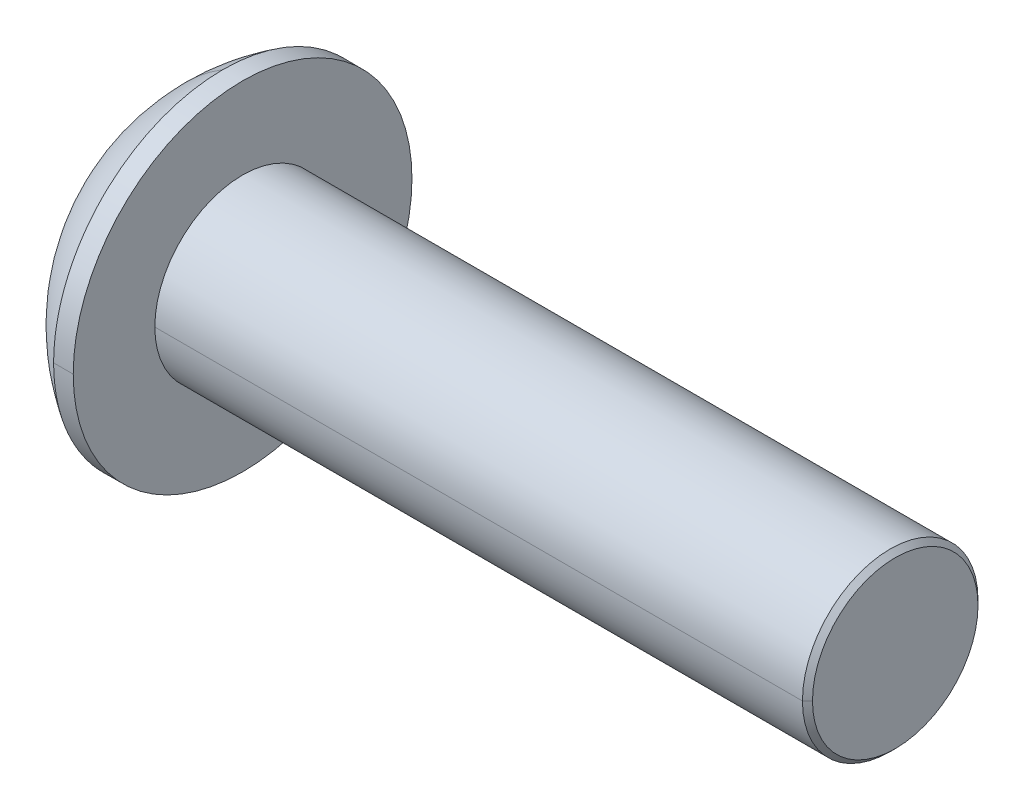
ISO-10303-21;
HEADER;
FILE_DESCRIPTION(('STEP AP214'),'2;1');
FILE_NAME('part.step','',(''),(''),'','','');
FILE_SCHEMA(('AUTOMOTIVE_DESIGN { 1 0 10303 214 1 1 1 1 }'));
ENDSEC;
DATA;
#1=APPLICATION_CONTEXT('core data for automotive mechanical design processes');
#2=APPLICATION_PROTOCOL_DEFINITION('international standard','automotive_design',2000,#1);
#3=PRODUCT_CONTEXT('',#1,'mechanical');
#4=PRODUCT('Part','Part','',(#3));
#5=PRODUCT_RELATED_PRODUCT_CATEGORY('part','',(#4));
#6=PRODUCT_DEFINITION_FORMATION('','',#4);
#7=PRODUCT_DEFINITION_CONTEXT('part definition',#1,'design');
#8=PRODUCT_DEFINITION('design','',#6,#7);
#9=PRODUCT_DEFINITION_SHAPE('','',#8);
#10=(LENGTH_UNIT() NAMED_UNIT(*) SI_UNIT(.MILLI.,.METRE.));
#11=(NAMED_UNIT(*) PLANE_ANGLE_UNIT() SI_UNIT($,.RADIAN.));
#12=(NAMED_UNIT(*) SI_UNIT($,.STERADIAN.) SOLID_ANGLE_UNIT());
#13=UNCERTAINTY_MEASURE_WITH_UNIT(LENGTH_MEASURE(1.E-05),#10,'distance_accuracy_value','');
#14=(GEOMETRIC_REPRESENTATION_CONTEXT(3) GLOBAL_UNCERTAINTY_ASSIGNED_CONTEXT((#13)) GLOBAL_UNIT_ASSIGNED_CONTEXT((#10,
#11,#12)) REPRESENTATION_CONTEXT('',''));
#15=CARTESIAN_POINT('',(0.,0.,0.));
#16=DIRECTION('',(0.,0.,1.));
#17=DIRECTION('',(1.,0.,0.));
#18=AXIS2_PLACEMENT_3D('',#15,#16,#17);
#19=CARTESIAN_POINT('',(14.5542,0.,0.));
#20=DIRECTION('',(-1.,0.,0.));
#21=DIRECTION('',(0.,0.,1.));
#22=AXIS2_PLACEMENT_3D('',#19,#20,#21);
#23=PLANE('',#22);
#24=CARTESIAN_POINT('',(14.5542,0.,0.));
#25=DIRECTION('',(-1.,0.,0.));
#26=DIRECTION('',(0.,0.,1.));
#27=AXIS2_PLACEMENT_3D('',#24,#25,#26);
#28=CIRCLE('',#27,1.61036);
#29=CARTESIAN_POINT('',(14.5542,0.,1.61036));
#30=VERTEX_POINT('',#29);
#31=CARTESIAN_POINT('',(14.5542,0.,-1.61036));
#32=VERTEX_POINT('',#31);
#33=EDGE_CURVE('E9',#30,#32,#28,.T.);
#34=ORIENTED_EDGE('',*,*,#33,.F.);
#35=CARTESIAN_POINT('',(14.5542,0.,0.));
#36=DIRECTION('',(-1.,0.,0.));
#37=DIRECTION('',(0.,0.,1.));
#38=AXIS2_PLACEMENT_3D('',#35,#36,#37);
#39=CIRCLE('',#38,1.61036);
#40=EDGE_CURVE('E364',#32,#30,#39,.T.);
#41=ORIENTED_EDGE('',*,*,#40,.F.);
#42=EDGE_LOOP('',(#34,#41));
#43=FACE_BOUND('',#42,.T.);
#44=ADVANCED_FACE('F15',(#43),#23,.F.);
#45=CARTESIAN_POINT('',(14.5542,0.,0.));
#46=DIRECTION('',(-1.,0.,0.));
#47=DIRECTION('',(0.,0.,1.));
#48=AXIS2_PLACEMENT_3D('',#45,#46,#47);
#49=CONICAL_SURFACE('',#48,1.61036,0.785398163397432);
#50=ORIENTED_EDGE('',*,*,#33,.T.);
#51=DIRECTION('',(-0.707106781186559,0.,-0.707106781186537));
#52=VECTOR('',#51,1.);
#53=CARTESIAN_POINT('',(14.5542,0.,-1.61036));
#54=LINE('',#53,#52);
#55=CARTESIAN_POINT('',(14.45641,0.,-1.70815));
#56=VERTEX_POINT('',#55);
#57=EDGE_CURVE('E362',#32,#56,#54,.T.);
#58=ORIENTED_EDGE('',*,*,#57,.T.);
#59=CARTESIAN_POINT('',(14.45641,0.,0.));
#60=DIRECTION('',(-1.,0.,0.));
#61=DIRECTION('',(0.,0.,1.));
#62=AXIS2_PLACEMENT_3D('',#59,#60,#61);
#63=CIRCLE('',#62,1.70815);
#64=CARTESIAN_POINT('',(14.45641,0.,1.70815));
#65=VERTEX_POINT('',#64);
#66=EDGE_CURVE('E359',#65,#56,#63,.T.);
#67=ORIENTED_EDGE('',*,*,#66,.F.);
#68=DIRECTION('',(-0.707106781186559,0.,0.707106781186537));
#69=VECTOR('',#68,1.);
#70=CARTESIAN_POINT('',(14.5542,0.,1.61036));
#71=LINE('',#70,#69);
#72=EDGE_CURVE('E23',#30,#65,#71,.T.);
#73=ORIENTED_EDGE('',*,*,#72,.F.);
#74=EDGE_LOOP('',(#50,#58,#67,#73));
#75=FACE_BOUND('',#74,.T.);
#76=ADVANCED_FACE('F378',(#75),#49,.T.);
#77=CARTESIAN_POINT('',(14.5542,0.,0.));
#78=DIRECTION('',(-1.,0.,0.));
#79=DIRECTION('',(0.,0.,1.));
#80=AXIS2_PLACEMENT_3D('',#77,#78,#79);
#81=CONICAL_SURFACE('',#80,1.61036,0.785398163397432);
#82=ORIENTED_EDGE('',*,*,#57,.F.);
#83=ORIENTED_EDGE('',*,*,#40,.T.);
#84=ORIENTED_EDGE('',*,*,#72,.T.);
#85=CARTESIAN_POINT('',(14.45641,0.,0.));
#86=DIRECTION('',(-1.,0.,0.));
#87=DIRECTION('',(0.,0.,1.));
#88=AXIS2_PLACEMENT_3D('',#85,#86,#87);
#89=CIRCLE('',#88,1.70815);
#90=EDGE_CURVE('E351',#56,#65,#89,.T.);
#91=ORIENTED_EDGE('',*,*,#90,.F.);
#92=EDGE_LOOP('',(#82,#83,#84,#91));
#93=FACE_BOUND('',#92,.T.);
#94=ADVANCED_FACE('F374',(#93),#81,.T.);
#95=CARTESIAN_POINT('',(0.,0.,0.));
#96=DIRECTION('',(-1.,0.,0.));
#97=DIRECTION('',(0.,0.,1.));
#98=AXIS2_PLACEMENT_3D('',#95,#96,#97);
#99=CYLINDRICAL_SURFACE('',#98,1.70815);
#100=ORIENTED_EDGE('',*,*,#66,.T.);
#101=DIRECTION('',(-1.,0.,0.));
#102=VECTOR('',#101,1.);
#103=CARTESIAN_POINT('',(0.,0.,-1.70815));
#104=LINE('',#103,#102);
#105=CARTESIAN_POINT('',(1.8542,0.,-1.70815));
#106=VERTEX_POINT('',#105);
#107=EDGE_CURVE('E348',#56,#106,#104,.T.);
#108=ORIENTED_EDGE('',*,*,#107,.T.);
#109=CARTESIAN_POINT('',(1.8542,0.,0.));
#110=DIRECTION('',(-1.,0.,0.));
#111=DIRECTION('',(0.,0.,1.));
#112=AXIS2_PLACEMENT_3D('',#109,#110,#111);
#113=CIRCLE('',#112,1.70815);
#114=CARTESIAN_POINT('',(1.8542,0.,1.70815));
#115=VERTEX_POINT('',#114);
#116=EDGE_CURVE('E340',#115,#106,#113,.T.);
#117=ORIENTED_EDGE('',*,*,#116,.F.);
#118=DIRECTION('',(-1.,0.,0.));
#119=VECTOR('',#118,1.);
#120=CARTESIAN_POINT('',(0.,0.,1.70815));
#121=LINE('',#120,#119);
#122=EDGE_CURVE('E354',#65,#115,#121,.T.);
#123=ORIENTED_EDGE('',*,*,#122,.F.);
#124=EDGE_LOOP('',(#100,#108,#117,#123));
#125=FACE_BOUND('',#124,.T.);
#126=ADVANCED_FACE('F381',(#125),#99,.T.);
#127=CARTESIAN_POINT('',(0.,0.,0.));
#128=DIRECTION('',(-1.,0.,0.));
#129=DIRECTION('',(0.,0.,1.));
#130=AXIS2_PLACEMENT_3D('',#127,#128,#129);
#131=CYLINDRICAL_SURFACE('',#130,1.70815);
#132=ORIENTED_EDGE('',*,*,#107,.F.);
#133=ORIENTED_EDGE('',*,*,#90,.T.);
#134=ORIENTED_EDGE('',*,*,#122,.T.);
#135=CARTESIAN_POINT('',(1.8542,0.,0.));
#136=DIRECTION('',(-1.,0.,0.));
#137=DIRECTION('',(0.,0.,1.));
#138=AXIS2_PLACEMENT_3D('',#135,#136,#137);
#139=CIRCLE('',#138,1.70815);
#140=EDGE_CURVE('E342',#106,#115,#139,.T.);
#141=ORIENTED_EDGE('',*,*,#140,.F.);
#142=EDGE_LOOP('',(#132,#133,#134,#141));
#143=FACE_BOUND('',#142,.T.);
#144=ADVANCED_FACE('F383',(#143),#131,.T.);
#145=CARTESIAN_POINT('',(1.8542,1.70815,0.));
#146=DIRECTION('',(-1.,0.,0.));
#147=DIRECTION('',(0.,0.,1.));
#148=AXIS2_PLACEMENT_3D('',#145,#146,#147);
#149=PLANE('',#148);
#150=ORIENTED_EDGE('',*,*,#116,.T.);
#151=ORIENTED_EDGE('',*,*,#140,.T.);
#152=EDGE_LOOP('',(#150,#151));
#153=FACE_BOUND('',#152,.T.);
#154=CARTESIAN_POINT('',(1.8542,0.,0.));
#155=DIRECTION('',(-1.,0.,0.));
#156=DIRECTION('',(0.,0.,1.));
#157=AXIS2_PLACEMENT_3D('',#154,#155,#156);
#158=CIRCLE('',#157,3.29565);
#159=CARTESIAN_POINT('',(1.8542,0.,3.29565));
#160=VERTEX_POINT('',#159);
#161=CARTESIAN_POINT('',(1.8542,0.,-3.29565));
#162=VERTEX_POINT('',#161);
#163=EDGE_CURVE('E300',#160,#162,#158,.T.);
#164=ORIENTED_EDGE('',*,*,#163,.F.);
#165=CARTESIAN_POINT('',(1.8542,0.,0.));
#166=DIRECTION('',(-1.,0.,0.));
#167=DIRECTION('',(0.,0.,1.));
#168=AXIS2_PLACEMENT_3D('',#165,#166,#167);
#169=CIRCLE('',#168,3.29565);
#170=EDGE_CURVE('E337',#162,#160,#169,.T.);
#171=ORIENTED_EDGE('',*,*,#170,.F.);
#172=EDGE_LOOP('',(#164,#171));
#173=FACE_BOUND('',#172,.T.);
#174=ADVANCED_FACE('F387',(#153,#173),#149,.F.);
#175=CARTESIAN_POINT('',(-997.989959248641,0.,0.));
#176=DIRECTION('',(-1.,0.,0.));
#177=DIRECTION('',(0.,0.,1.));
#178=AXIS2_PLACEMENT_3D('',#175,#176,#177);
#179=CONICAL_SURFACE('',#178,1732.05080756886,1.0471975511966);
#180=DIRECTION('',(-0.5,0.,0.866025403784436));
#181=VECTOR('',#180,1.);
#182=CARTESIAN_POINT('',(2.01004075135859,0.,0.));
#183=LINE('',#182,#181);
#184=CARTESIAN_POINT('',(2.01004075135859,0.,0.));
#185=VERTEX_POINT('',#184);
#186=CARTESIAN_POINT('',(1.3208,0.,1.1938));
#187=VERTEX_POINT('',#186);
#188=EDGE_CURVE('E293',#185,#187,#183,.T.);
#189=ORIENTED_EDGE('',*,*,#188,.F.);
#190=DIRECTION('',(-0.5,0.,-0.866025403784436));
#191=VECTOR('',#190,1.);
#192=CARTESIAN_POINT('',(2.01004075135859,0.,0.));
#193=LINE('',#192,#191);
#194=CARTESIAN_POINT('',(1.3208,0.,-1.1938));
#195=VERTEX_POINT('',#194);
#196=EDGE_CURVE('E323',#185,#195,#193,.T.);
#197=ORIENTED_EDGE('',*,*,#196,.T.);
#198=CARTESIAN_POINT('',(1.3208,0.,0.));
#199=DIRECTION('',(-1.,0.,0.));
#200=DIRECTION('',(0.,0.,1.));
#201=AXIS2_PLACEMENT_3D('',#198,#199,#200);
#202=CIRCLE('',#201,1.1938);
#203=CARTESIAN_POINT('',(1.3208,-1.03386112703786,-0.5969));
#204=VERTEX_POINT('',#203);
#205=EDGE_CURVE('E255',#195,#204,#202,.T.);
#206=ORIENTED_EDGE('',*,*,#205,.T.);
#207=CARTESIAN_POINT('',(1.3208,0.,0.));
#208=DIRECTION('',(-1.,0.,0.));
#209=DIRECTION('',(0.,0.,1.));
#210=AXIS2_PLACEMENT_3D('',#207,#208,#209);
#211=CIRCLE('',#210,1.1938);
#212=CARTESIAN_POINT('',(1.3208,-1.03386112703786,0.5969));
#213=VERTEX_POINT('',#212);
#214=EDGE_CURVE('E246',#204,#213,#211,.T.);
#215=ORIENTED_EDGE('',*,*,#214,.T.);
#216=CARTESIAN_POINT('',(1.3208,0.,0.));
#217=DIRECTION('',(-1.,0.,0.));
#218=DIRECTION('',(0.,0.,1.));
#219=AXIS2_PLACEMENT_3D('',#216,#217,#218);
#220=CIRCLE('',#219,1.1938);
#221=EDGE_CURVE('E251',#213,#187,#220,.T.);
#222=ORIENTED_EDGE('',*,*,#221,.T.);
#223=EDGE_LOOP('',(#189,#197,#206,#215,#222));
#224=FACE_BOUND('',#223,.T.);
#225=ADVANCED_FACE('F386',(#224),#179,.F.);
#226=CARTESIAN_POINT('',(0.,0.,0.));
#227=DIRECTION('',(-1.,0.,0.));
#228=DIRECTION('',(0.,0.,1.));
#229=AXIS2_PLACEMENT_3D('',#226,#227,#228);
#230=CYLINDRICAL_SURFACE('',#229,3.29565);
#231=DIRECTION('',(-1.,0.,0.));
#232=VECTOR('',#231,1.);
#233=CARTESIAN_POINT('',(0.,0.,-3.29565));
#234=LINE('',#233,#232);
#235=CARTESIAN_POINT('',(1.4732,0.,-3.29565));
#236=VERTEX_POINT('',#235);
#237=EDGE_CURVE('E302',#162,#236,#234,.T.);
#238=ORIENTED_EDGE('',*,*,#237,.F.);
#239=ORIENTED_EDGE('',*,*,#170,.T.);
#240=DIRECTION('',(-1.,0.,0.));
#241=VECTOR('',#240,1.);
#242=CARTESIAN_POINT('',(0.,0.,3.29565));
#243=LINE('',#242,#241);
#244=CARTESIAN_POINT('',(1.4732,0.,3.29565));
#245=VERTEX_POINT('',#244);
#246=EDGE_CURVE('E331',#160,#245,#243,.T.);
#247=ORIENTED_EDGE('',*,*,#246,.T.);
#248=CARTESIAN_POINT('',(1.4732,0.,0.));
#249=DIRECTION('',(-1.,0.,0.));
#250=DIRECTION('',(0.,0.,1.));
#251=AXIS2_PLACEMENT_3D('',#248,#249,#250);
#252=CIRCLE('',#251,3.29565);
#253=CARTESIAN_POINT('',(1.4732,-3.29565,0.));
#254=VERTEX_POINT('',#253);
#255=EDGE_CURVE('E296',#254,#245,#252,.T.);
#256=ORIENTED_EDGE('',*,*,#255,.F.);
#257=CARTESIAN_POINT('',(1.4732,0.,0.));
#258=DIRECTION('',(-1.,0.,0.));
#259=DIRECTION('',(0.,0.,1.));
#260=AXIS2_PLACEMENT_3D('',#257,#258,#259);
#261=CIRCLE('',#260,3.29565);
#262=EDGE_CURVE('E316',#236,#254,#261,.T.);
#263=ORIENTED_EDGE('',*,*,#262,.F.);
#264=EDGE_LOOP('',(#238,#239,#247,#256,#263));
#265=FACE_BOUND('',#264,.T.);
#266=ADVANCED_FACE('F399',(#265),#230,.T.);
#267=CARTESIAN_POINT('',(0.,0.,0.));
#268=DIRECTION('',(-1.,0.,0.));
#269=DIRECTION('',(0.,0.,1.));
#270=AXIS2_PLACEMENT_3D('',#267,#268,#269);
#271=CYLINDRICAL_SURFACE('',#270,3.29565);
#272=ORIENTED_EDGE('',*,*,#163,.T.);
#273=ORIENTED_EDGE('',*,*,#237,.T.);
#274=CARTESIAN_POINT('',(1.4732,0.,0.));
#275=DIRECTION('',(-1.,0.,0.));
#276=DIRECTION('',(0.,0.,1.));
#277=AXIS2_PLACEMENT_3D('',#274,#275,#276);
#278=CIRCLE('',#277,3.29565);
#279=CARTESIAN_POINT('',(1.4732,3.29565,0.));
#280=VERTEX_POINT('',#279);
#281=EDGE_CURVE('E315',#280,#236,#278,.T.);
#282=ORIENTED_EDGE('',*,*,#281,.F.);
#283=CARTESIAN_POINT('',(1.4732,0.,0.));
#284=DIRECTION('',(-1.,0.,0.));
#285=DIRECTION('',(0.,0.,1.));
#286=AXIS2_PLACEMENT_3D('',#283,#284,#285);
#287=CIRCLE('',#286,3.29565);
#288=EDGE_CURVE('E303',#245,#280,#287,.T.);
#289=ORIENTED_EDGE('',*,*,#288,.F.);
#290=ORIENTED_EDGE('',*,*,#246,.F.);
#291=EDGE_LOOP('',(#272,#273,#282,#289,#290));
#292=FACE_BOUND('',#291,.T.);
#293=ADVANCED_FACE('F395',(#292),#271,.T.);
#294=CARTESIAN_POINT('',(1.3208,-2.06772225407573,-1.1938));
#295=DIRECTION('',(1.,0.,0.));
#296=DIRECTION('',(0.,1.,0.));
#297=AXIS2_PLACEMENT_3D('',#294,#295,#296);
#298=PLANE('',#297);
#299=ORIENTED_EDGE('',*,*,#221,.F.);
#300=DIRECTION('',(0.,-0.5,-0.866025403784439));
#301=VECTOR('',#300,1.);
#302=CARTESIAN_POINT('',(1.3208,-1.37848150271715,0.));
#303=LINE('',#302,#301);
#304=CARTESIAN_POINT('',(1.3208,-0.689240751358574,1.1938));
#305=VERTEX_POINT('',#304);
#306=EDGE_CURVE('E317',#305,#213,#303,.T.);
#307=ORIENTED_EDGE('',*,*,#306,.F.);
#308=DIRECTION('',(0.,-1.,0.));
#309=VECTOR('',#308,1.);
#310=CARTESIAN_POINT('',(1.3208,-0.689240751358574,1.1938));
#311=LINE('',#310,#309);
#312=EDGE_CURVE('E284',#187,#305,#311,.T.);
#313=ORIENTED_EDGE('',*,*,#312,.F.);
#314=EDGE_LOOP('',(#299,#307,#313));
#315=FACE_BOUND('',#314,.T.);
#316=ADVANCED_FACE('F441',(#315),#298,.F.);
#317=CARTESIAN_POINT('',(1.3208,-2.06772225407573,-1.1938));
#318=DIRECTION('',(1.,0.,0.));
#319=DIRECTION('',(0.,1.,0.));
#320=AXIS2_PLACEMENT_3D('',#317,#318,#319);
#321=PLANE('',#320);
#322=ORIENTED_EDGE('',*,*,#214,.F.);
#323=DIRECTION('',(0.,0.5,-0.866025403784439));
#324=VECTOR('',#323,1.);
#325=CARTESIAN_POINT('',(1.3208,-0.689240751358574,-1.1938));
#326=LINE('',#325,#324);
#327=CARTESIAN_POINT('',(1.3208,-1.37848150271715,0.));
#328=VERTEX_POINT('',#327);
#329=EDGE_CURVE('E267',#328,#204,#326,.T.);
#330=ORIENTED_EDGE('',*,*,#329,.F.);
#331=DIRECTION('',(0.,-0.5,-0.866025403784439));
#332=VECTOR('',#331,1.);
#333=CARTESIAN_POINT('',(1.3208,-1.37848150271715,0.));
#334=LINE('',#333,#332);
#335=EDGE_CURVE('E319',#213,#328,#334,.T.);
#336=ORIENTED_EDGE('',*,*,#335,.F.);
#337=EDGE_LOOP('',(#322,#330,#336));
#338=FACE_BOUND('',#337,.T.);
#339=ADVANCED_FACE('F439',(#338),#321,.F.);
#340=CARTESIAN_POINT('',(1.3208,-2.06772225407573,-1.1938));
#341=DIRECTION('',(1.,0.,0.));
#342=DIRECTION('',(0.,1.,0.));
#343=AXIS2_PLACEMENT_3D('',#340,#341,#342);
#344=PLANE('',#343);
#345=CARTESIAN_POINT('',(1.3208,0.,0.));
#346=DIRECTION('',(-1.,0.,0.));
#347=DIRECTION('',(0.,0.,1.));
#348=AXIS2_PLACEMENT_3D('',#345,#346,#347);
#349=CIRCLE('',#348,1.1938);
#350=CARTESIAN_POINT('',(1.3208,1.03386112703786,0.5969));
#351=VERTEX_POINT('',#350);
#352=EDGE_CURVE('E266',#187,#351,#349,.T.);
#353=ORIENTED_EDGE('',*,*,#352,.F.);
#354=DIRECTION('',(0.,-1.,0.));
#355=VECTOR('',#354,1.);
#356=CARTESIAN_POINT('',(1.3208,-0.689240751358574,1.1938));
#357=LINE('',#356,#355);
#358=CARTESIAN_POINT('',(1.3208,0.689240751358576,1.1938));
#359=VERTEX_POINT('',#358);
#360=EDGE_CURVE('E276',#359,#187,#357,.T.);
#361=ORIENTED_EDGE('',*,*,#360,.F.);
#362=DIRECTION('',(0.,-0.5,0.866025403784439));
#363=VECTOR('',#362,1.);
#364=CARTESIAN_POINT('',(1.3208,0.689240751358576,1.1938));
#365=LINE('',#364,#363);
#366=EDGE_CURVE('E228',#351,#359,#365,.T.);
#367=ORIENTED_EDGE('',*,*,#366,.F.);
#368=EDGE_LOOP('',(#353,#361,#367));
#369=FACE_BOUND('',#368,.T.);
#370=ADVANCED_FACE('F444',(#369),#344,.F.);
#371=CARTESIAN_POINT('',(1.3208,-2.06772225407573,-1.1938));
#372=DIRECTION('',(1.,0.,0.));
#373=DIRECTION('',(0.,1.,0.));
#374=AXIS2_PLACEMENT_3D('',#371,#372,#373);
#375=PLANE('',#374);
#376=ORIENTED_EDGE('',*,*,#205,.F.);
#377=DIRECTION('',(0.,1.,0.));
#378=VECTOR('',#377,1.);
#379=CARTESIAN_POINT('',(1.3208,0.689240751358577,-1.1938));
#380=LINE('',#379,#378);
#381=CARTESIAN_POINT('',(1.3208,-0.689240751358574,-1.1938));
#382=VERTEX_POINT('',#381);
#383=EDGE_CURVE('E180',#382,#195,#380,.T.);
#384=ORIENTED_EDGE('',*,*,#383,.F.);
#385=DIRECTION('',(0.,0.5,-0.866025403784439));
#386=VECTOR('',#385,1.);
#387=CARTESIAN_POINT('',(1.3208,-0.689240751358574,-1.1938));
#388=LINE('',#387,#386);
#389=EDGE_CURVE('E272',#204,#382,#388,.T.);
#390=ORIENTED_EDGE('',*,*,#389,.F.);
#391=EDGE_LOOP('',(#376,#384,#390));
#392=FACE_BOUND('',#391,.T.);
#393=ADVANCED_FACE('F450',(#392),#375,.F.);
#394=CARTESIAN_POINT('',(-997.989959248641,0.,0.));
#395=DIRECTION('',(-1.,0.,0.));
#396=DIRECTION('',(0.,0.,1.));
#397=AXIS2_PLACEMENT_3D('',#394,#395,#396);
#398=CONICAL_SURFACE('',#397,1732.05080756886,1.0471975511966);
#399=ORIENTED_EDGE('',*,*,#196,.F.);
#400=ORIENTED_EDGE('',*,*,#188,.T.);
#401=ORIENTED_EDGE('',*,*,#352,.T.);
#402=CARTESIAN_POINT('',(1.3208,0.,0.));
#403=DIRECTION('',(-1.,0.,0.));
#404=DIRECTION('',(0.,0.,1.));
#405=AXIS2_PLACEMENT_3D('',#402,#403,#404);
#406=CIRCLE('',#405,1.1938);
#407=CARTESIAN_POINT('',(1.3208,1.03386112703786,-0.5969));
#408=VERTEX_POINT('',#407);
#409=EDGE_CURVE('E211',#351,#408,#406,.T.);
#410=ORIENTED_EDGE('',*,*,#409,.T.);
#411=CARTESIAN_POINT('',(1.3208,0.,0.));
#412=DIRECTION('',(-1.,0.,0.));
#413=DIRECTION('',(0.,0.,1.));
#414=AXIS2_PLACEMENT_3D('',#411,#412,#413);
#415=CIRCLE('',#414,1.1938);
#416=EDGE_CURVE('E183',#408,#195,#415,.T.);
#417=ORIENTED_EDGE('',*,*,#416,.T.);
#418=EDGE_LOOP('',(#399,#400,#401,#410,#417));
#419=FACE_BOUND('',#418,.T.);
#420=ADVANCED_FACE('F446',(#419),#398,.F.);
#421=CARTESIAN_POINT('',(1.3208,-1.37848150271715,0.));
#422=DIRECTION('',(0.,0.866025403784439,-0.5));
#423=DIRECTION('',(-1.,0.,0.));
#424=AXIS2_PLACEMENT_3D('',#421,#422,#423);
#425=PLANE('',#424);
#426=ORIENTED_EDGE('',*,*,#306,.T.);
#427=ORIENTED_EDGE('',*,*,#335,.T.);
#428=DIRECTION('',(-1.,0.,0.));
#429=VECTOR('',#428,1.);
#430=CARTESIAN_POINT('',(1.3208,-1.37848150271715,0.));
#431=LINE('',#430,#429);
#432=CARTESIAN_POINT('',(0.,-1.37848150271715,0.));
#433=VERTEX_POINT('',#432);
#434=EDGE_CURVE('E277',#328,#433,#431,.T.);
#435=ORIENTED_EDGE('',*,*,#434,.T.);
#436=DIRECTION('',(0.,-0.5,-0.866025403784439));
#437=VECTOR('',#436,1.);
#438=CARTESIAN_POINT('',(0.,-1.37848150271715,0.));
#439=LINE('',#438,#437);
#440=CARTESIAN_POINT('',(0.,-0.689240751358574,1.1938));
#441=VERTEX_POINT('',#440);
#442=EDGE_CURVE('E236',#441,#433,#439,.T.);
#443=ORIENTED_EDGE('',*,*,#442,.F.);
#444=DIRECTION('',(-1.,0.,0.));
#445=VECTOR('',#444,1.);
#446=CARTESIAN_POINT('',(1.3208,-0.689240751358574,1.1938));
#447=LINE('',#446,#445);
#448=EDGE_CURVE('E290',#305,#441,#447,.T.);
#449=ORIENTED_EDGE('',*,*,#448,.F.);
#450=EDGE_LOOP('',(#426,#427,#435,#443,#449));
#451=FACE_BOUND('',#450,.T.);
#452=ADVANCED_FACE('F448',(#451),#425,.T.);
#453=CARTESIAN_POINT('',(3.50132362607759,0.,0.));
#454=DIRECTION('',(0.,0.,-1.));
#455=DIRECTION('',(0.,1.,0.));
#456=AXIS2_PLACEMENT_3D('',#453,#454,#455);
#457=SPHERICAL_SURFACE('',#456,3.86970210289553);
#458=ORIENTED_EDGE('',*,*,#281,.T.);
#459=ORIENTED_EDGE('',*,*,#262,.T.);
#460=CARTESIAN_POINT('',(3.50132362607759,0.,0.));
#461=DIRECTION('',(0.,0.,-1.));
#462=DIRECTION('',(0.,1.,0.));
#463=AXIS2_PLACEMENT_3D('',#460,#461,#462);
#464=CIRCLE('',#463,3.86970210289553);
#465=CARTESIAN_POINT('',(0.,-1.647825,0.));
#466=VERTEX_POINT('',#465);
#467=EDGE_CURVE('E289',#254,#466,#464,.T.);
#468=ORIENTED_EDGE('',*,*,#467,.T.);
#469=CARTESIAN_POINT('',(0.,0.,0.));
#470=DIRECTION('',(-1.,0.,0.));
#471=DIRECTION('',(0.,0.,1.));
#472=AXIS2_PLACEMENT_3D('',#469,#470,#471);
#473=CIRCLE('',#472,1.647825);
#474=CARTESIAN_POINT('',(0.,1.647825,0.));
#475=VERTEX_POINT('',#474);
#476=EDGE_CURVE('E191',#475,#466,#473,.T.);
#477=ORIENTED_EDGE('',*,*,#476,.F.);
#478=CARTESIAN_POINT('',(3.50132362607759,0.,0.));
#479=DIRECTION('',(0.,0.,1.));
#480=DIRECTION('',(1.,0.,0.));
#481=AXIS2_PLACEMENT_3D('',#478,#479,#480);
#482=CIRCLE('',#481,3.86970210289553);
#483=EDGE_CURVE('E310',#280,#475,#482,.T.);
#484=ORIENTED_EDGE('',*,*,#483,.F.);
#485=EDGE_LOOP('',(#458,#459,#468,#477,#484));
#486=FACE_BOUND('',#485,.T.);
#487=ADVANCED_FACE('F402',(#486),#457,.T.);
#488=CARTESIAN_POINT('',(3.50132362607759,0.,0.));
#489=DIRECTION('',(0.,0.,-1.));
#490=DIRECTION('',(0.,1.,0.));
#491=AXIS2_PLACEMENT_3D('',#488,#489,#490);
#492=SPHERICAL_SURFACE('',#491,3.86970210289553);
#493=ORIENTED_EDGE('',*,*,#467,.F.);
#494=ORIENTED_EDGE('',*,*,#255,.T.);
#495=ORIENTED_EDGE('',*,*,#288,.T.);
#496=ORIENTED_EDGE('',*,*,#483,.T.);
#497=CARTESIAN_POINT('',(0.,0.,0.));
#498=DIRECTION('',(-1.,0.,0.));
#499=DIRECTION('',(0.,0.,1.));
#500=AXIS2_PLACEMENT_3D('',#497,#498,#499);
#501=CIRCLE('',#500,1.647825);
#502=EDGE_CURVE('E221',#466,#475,#501,.T.);
#503=ORIENTED_EDGE('',*,*,#502,.F.);
#504=EDGE_LOOP('',(#493,#494,#495,#496,#503));
#505=FACE_BOUND('',#504,.T.);
#506=ADVANCED_FACE('F407',(#505),#492,.T.);
#507=CARTESIAN_POINT('',(1.3208,-0.689240751358574,1.1938));
#508=DIRECTION('',(0.,0.,-1.));
#509=DIRECTION('',(-1.,0.,0.));
#510=AXIS2_PLACEMENT_3D('',#507,#508,#509);
#511=PLANE('',#510);
#512=ORIENTED_EDGE('',*,*,#360,.T.);
#513=ORIENTED_EDGE('',*,*,#312,.T.);
#514=ORIENTED_EDGE('',*,*,#448,.T.);
#515=DIRECTION('',(0.,-1.,0.));
#516=VECTOR('',#515,1.);
#517=CARTESIAN_POINT('',(0.,-0.689240751358574,1.1938));
#518=LINE('',#517,#516);
#519=CARTESIAN_POINT('',(0.,0.689240751358576,1.1938));
#520=VERTEX_POINT('',#519);
#521=EDGE_CURVE('E235',#520,#441,#518,.T.);
#522=ORIENTED_EDGE('',*,*,#521,.F.);
#523=DIRECTION('',(-1.,0.,0.));
#524=VECTOR('',#523,1.);
#525=CARTESIAN_POINT('',(1.3208,0.689240751358576,1.1938));
#526=LINE('',#525,#524);
#527=EDGE_CURVE('E265',#359,#520,#526,.T.);
#528=ORIENTED_EDGE('',*,*,#527,.F.);
#529=EDGE_LOOP('',(#512,#513,#514,#522,#528));
#530=FACE_BOUND('',#529,.T.);
#531=ADVANCED_FACE('F462',(#530),#511,.T.);
#532=CARTESIAN_POINT('',(1.3208,-0.689240751358574,-1.1938));
#533=DIRECTION('',(0.,0.866025403784439,0.5));
#534=DIRECTION('',(1.,0.,0.));
#535=AXIS2_PLACEMENT_3D('',#532,#533,#534);
#536=PLANE('',#535);
#537=ORIENTED_EDGE('',*,*,#329,.T.);
#538=ORIENTED_EDGE('',*,*,#389,.T.);
#539=DIRECTION('',(-1.,0.,0.));
#540=VECTOR('',#539,1.);
#541=CARTESIAN_POINT('',(1.3208,-0.689240751358574,-1.1938));
#542=LINE('',#541,#540);
#543=CARTESIAN_POINT('',(0.,-0.689240751358574,-1.1938));
#544=VERTEX_POINT('',#543);
#545=EDGE_CURVE('E207',#382,#544,#542,.T.);
#546=ORIENTED_EDGE('',*,*,#545,.T.);
#547=DIRECTION('',(0.,0.5,-0.866025403784439));
#548=VECTOR('',#547,1.);
#549=CARTESIAN_POINT('',(0.,-0.689240751358574,-1.1938));
#550=LINE('',#549,#548);
#551=EDGE_CURVE('E241',#433,#544,#550,.T.);
#552=ORIENTED_EDGE('',*,*,#551,.F.);
#553=ORIENTED_EDGE('',*,*,#434,.F.);
#554=EDGE_LOOP('',(#537,#538,#546,#552,#553));
#555=FACE_BOUND('',#554,.T.);
#556=ADVANCED_FACE('F467',(#555),#536,.T.);
#557=CARTESIAN_POINT('',(1.3208,0.689240751358576,1.1938));
#558=DIRECTION('',(0.,-0.866025403784439,-0.5));
#559=DIRECTION('',(0.,0.5,-0.866025403784439));
#560=AXIS2_PLACEMENT_3D('',#557,#558,#559);
#561=PLANE('',#560);
#562=DIRECTION('',(0.,-0.5,0.866025403784439));
#563=VECTOR('',#562,1.);
#564=CARTESIAN_POINT('',(1.3208,0.689240751358576,1.1938));
#565=LINE('',#564,#563);
#566=CARTESIAN_POINT('',(1.3208,1.37848150271715,0.));
#567=VERTEX_POINT('',#566);
#568=EDGE_CURVE('E223',#567,#351,#565,.T.);
#569=ORIENTED_EDGE('',*,*,#568,.T.);
#570=ORIENTED_EDGE('',*,*,#366,.T.);
#571=ORIENTED_EDGE('',*,*,#527,.T.);
#572=DIRECTION('',(0.,-0.5,0.866025403784439));
#573=VECTOR('',#572,1.);
#574=CARTESIAN_POINT('',(0.,0.689240751358576,1.1938));
#575=LINE('',#574,#573);
#576=CARTESIAN_POINT('',(0.,1.37848150271715,0.));
#577=VERTEX_POINT('',#576);
#578=EDGE_CURVE('E216',#577,#520,#575,.T.);
#579=ORIENTED_EDGE('',*,*,#578,.F.);
#580=DIRECTION('',(-1.,0.,0.));
#581=VECTOR('',#580,1.);
#582=CARTESIAN_POINT('',(1.3208,1.37848150271715,0.));
#583=LINE('',#582,#581);
#584=EDGE_CURVE('E202',#567,#577,#583,.T.);
#585=ORIENTED_EDGE('',*,*,#584,.F.);
#586=EDGE_LOOP('',(#569,#570,#571,#579,#585));
#587=FACE_BOUND('',#586,.T.);
#588=ADVANCED_FACE('F468',(#587),#561,.T.);
#589=CARTESIAN_POINT('',(1.3208,-2.06772225407573,-1.1938));
#590=DIRECTION('',(1.,0.,0.));
#591=DIRECTION('',(0.,1.,0.));
#592=AXIS2_PLACEMENT_3D('',#589,#590,#591);
#593=PLANE('',#592);
#594=ORIENTED_EDGE('',*,*,#409,.F.);
#595=ORIENTED_EDGE('',*,*,#568,.F.);
#596=DIRECTION('',(0.,0.5,0.866025403784439));
#597=VECTOR('',#596,1.);
#598=CARTESIAN_POINT('',(1.3208,1.37848150271715,0.));
#599=LINE('',#598,#597);
#600=EDGE_CURVE('E200',#408,#567,#599,.T.);
#601=ORIENTED_EDGE('',*,*,#600,.F.);
#602=EDGE_LOOP('',(#594,#595,#601));
#603=FACE_BOUND('',#602,.T.);
#604=ADVANCED_FACE('F478',(#603),#593,.F.);
#605=CARTESIAN_POINT('',(1.3208,0.689240751358577,-1.1938));
#606=DIRECTION('',(0.,0.,1.));
#607=DIRECTION('',(1.,0.,0.));
#608=AXIS2_PLACEMENT_3D('',#605,#606,#607);
#609=PLANE('',#608);
#610=ORIENTED_EDGE('',*,*,#383,.T.);
#611=DIRECTION('',(0.,1.,0.));
#612=VECTOR('',#611,1.);
#613=CARTESIAN_POINT('',(1.3208,0.689240751358577,-1.1938));
#614=LINE('',#613,#612);
#615=CARTESIAN_POINT('',(1.3208,0.689240751358577,-1.1938));
#616=VERTEX_POINT('',#615);
#617=EDGE_CURVE('E166',#195,#616,#614,.T.);
#618=ORIENTED_EDGE('',*,*,#617,.T.);
#619=DIRECTION('',(-1.,0.,0.));
#620=VECTOR('',#619,1.);
#621=CARTESIAN_POINT('',(1.3208,0.689240751358577,-1.1938));
#622=LINE('',#621,#620);
#623=CARTESIAN_POINT('',(0.,0.689240751358577,-1.1938));
#624=VERTEX_POINT('',#623);
#625=EDGE_CURVE('E174',#616,#624,#622,.T.);
#626=ORIENTED_EDGE('',*,*,#625,.T.);
#627=DIRECTION('',(0.,1.,0.));
#628=VECTOR('',#627,1.);
#629=CARTESIAN_POINT('',(0.,0.689240751358577,-1.1938));
#630=LINE('',#629,#628);
#631=EDGE_CURVE('E218',#544,#624,#630,.T.);
#632=ORIENTED_EDGE('',*,*,#631,.F.);
#633=ORIENTED_EDGE('',*,*,#545,.F.);
#634=EDGE_LOOP('',(#610,#618,#626,#632,#633));
#635=FACE_BOUND('',#634,.T.);
#636=ADVANCED_FACE('F171',(#635),#609,.T.);
#637=CARTESIAN_POINT('',(1.3208,-2.06772225407573,-1.1938));
#638=DIRECTION('',(1.,0.,0.));
#639=DIRECTION('',(0.,1.,0.));
#640=AXIS2_PLACEMENT_3D('',#637,#638,#639);
#641=PLANE('',#640);
#642=ORIENTED_EDGE('',*,*,#416,.F.);
#643=DIRECTION('',(0.,0.5,0.866025403784439));
#644=VECTOR('',#643,1.);
#645=CARTESIAN_POINT('',(1.3208,1.37848150271715,0.));
#646=LINE('',#645,#644);
#647=EDGE_CURVE('E188',#616,#408,#646,.T.);
#648=ORIENTED_EDGE('',*,*,#647,.F.);
#649=ORIENTED_EDGE('',*,*,#617,.F.);
#650=EDGE_LOOP('',(#642,#648,#649));
#651=FACE_BOUND('',#650,.T.);
#652=ADVANCED_FACE('F198',(#651),#641,.F.);
#653=CARTESIAN_POINT('',(0.,0.,0.));
#654=DIRECTION('',(-1.,0.,0.));
#655=DIRECTION('',(0.,0.,1.));
#656=AXIS2_PLACEMENT_3D('',#653,#654,#655);
#657=PLANE('',#656);
#658=ORIENTED_EDGE('',*,*,#521,.T.);
#659=ORIENTED_EDGE('',*,*,#442,.T.);
#660=ORIENTED_EDGE('',*,*,#551,.T.);
#661=ORIENTED_EDGE('',*,*,#631,.T.);
#662=DIRECTION('',(0.,0.5,0.866025403784439));
#663=VECTOR('',#662,1.);
#664=CARTESIAN_POINT('',(0.,1.37848150271715,0.));
#665=LINE('',#664,#663);
#666=EDGE_CURVE('E195',#624,#577,#665,.T.);
#667=ORIENTED_EDGE('',*,*,#666,.T.);
#668=ORIENTED_EDGE('',*,*,#578,.T.);
#669=EDGE_LOOP('',(#658,#659,#660,#661,#667,#668));
#670=FACE_BOUND('',#669,.T.);
#671=ORIENTED_EDGE('',*,*,#476,.T.);
#672=ORIENTED_EDGE('',*,*,#502,.T.);
#673=EDGE_LOOP('',(#671,#672));
#674=FACE_BOUND('',#673,.T.);
#675=ADVANCED_FACE('F409',(#670,#674),#657,.T.);
#676=CARTESIAN_POINT('',(1.3208,1.37848150271715,0.));
#677=DIRECTION('',(0.,-0.866025403784439,0.5));
#678=DIRECTION('',(-1.,0.,0.));
#679=AXIS2_PLACEMENT_3D('',#676,#677,#678);
#680=PLANE('',#679);
#681=ORIENTED_EDGE('',*,*,#647,.T.);
#682=ORIENTED_EDGE('',*,*,#600,.T.);
#683=ORIENTED_EDGE('',*,*,#584,.T.);
#684=ORIENTED_EDGE('',*,*,#666,.F.);
#685=ORIENTED_EDGE('',*,*,#625,.F.);
#686=EDGE_LOOP('',(#681,#682,#683,#684,#685));
#687=FACE_BOUND('',#686,.T.);
#688=ADVANCED_FACE('F190',(#687),#680,.T.);
#689=CLOSED_SHELL('',(#44,#76,#94,#126,#144,#174,#225,#266,#293,#316,#339,#370,#393,#420,#452,
#487,#506,#531,#556,#588,#604,#636,#652,#675,#688));
#690=MANIFOLD_SOLID_BREP('B1',#689);
#691=ADVANCED_BREP_SHAPE_REPRESENTATION('',(#18,#690),#14);
#692=SHAPE_DEFINITION_REPRESENTATION(#9,#691);
ENDSEC;
END-ISO-10303-21;
